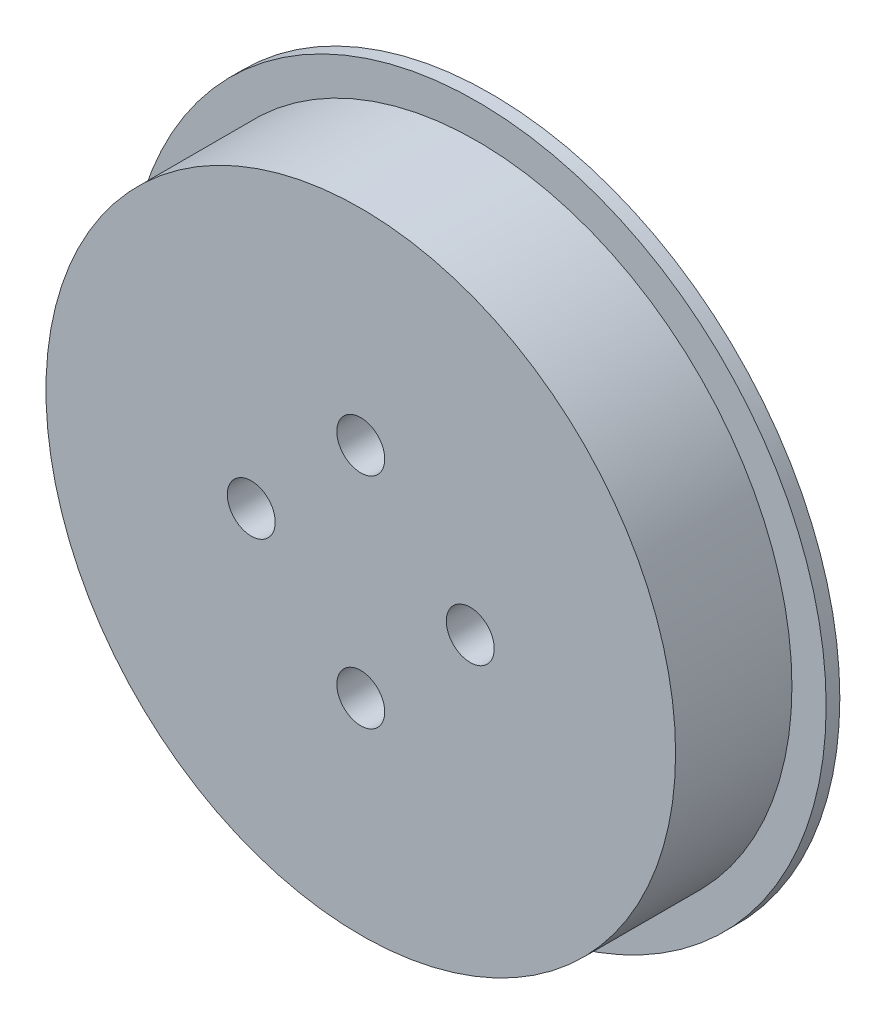
ISO-10303-21;
HEADER;
FILE_DESCRIPTION(('STEP AP214'),'2;1');
FILE_NAME('part.step','',(''),(''),'','','');
FILE_SCHEMA(('AUTOMOTIVE_DESIGN { 1 0 10303 214 1 1 1 1 }'));
ENDSEC;
DATA;
#1=APPLICATION_CONTEXT('core data for automotive mechanical design processes');
#2=APPLICATION_PROTOCOL_DEFINITION('international standard','automotive_design',2000,#1);
#3=PRODUCT_CONTEXT('',#1,'mechanical');
#4=PRODUCT('Part','Part','',(#3));
#5=PRODUCT_RELATED_PRODUCT_CATEGORY('part','',(#4));
#6=PRODUCT_DEFINITION_FORMATION('','',#4);
#7=PRODUCT_DEFINITION_CONTEXT('part definition',#1,'design');
#8=PRODUCT_DEFINITION('design','',#6,#7);
#9=PRODUCT_DEFINITION_SHAPE('','',#8);
#10=(LENGTH_UNIT() NAMED_UNIT(*) SI_UNIT(.MILLI.,.METRE.));
#11=(NAMED_UNIT(*) PLANE_ANGLE_UNIT() SI_UNIT($,.RADIAN.));
#12=(NAMED_UNIT(*) SI_UNIT($,.STERADIAN.) SOLID_ANGLE_UNIT());
#13=UNCERTAINTY_MEASURE_WITH_UNIT(LENGTH_MEASURE(1.E-05),#10,'distance_accuracy_value','');
#14=(GEOMETRIC_REPRESENTATION_CONTEXT(3) GLOBAL_UNCERTAINTY_ASSIGNED_CONTEXT((#13)) GLOBAL_UNIT_ASSIGNED_CONTEXT((#10,
#11,#12)) REPRESENTATION_CONTEXT('',''));
#15=CARTESIAN_POINT('',(0.,0.,0.));
#16=DIRECTION('',(0.,0.,1.));
#17=DIRECTION('',(1.,0.,0.));
#18=AXIS2_PLACEMENT_3D('',#15,#16,#17);
#19=CARTESIAN_POINT('',(0.,-8.,9.5));
#20=DIRECTION('',(0.,0.,-1.));
#21=DIRECTION('',(-1.,0.,0.));
#22=AXIS2_PLACEMENT_3D('',#19,#20,#21);
#23=CYLINDRICAL_SURFACE('',#22,1.75);
#24=CARTESIAN_POINT('',(0.,-8.,5.));
#25=DIRECTION('',(0.,0.,1.));
#26=DIRECTION('',(1.,0.,0.));
#27=AXIS2_PLACEMENT_3D('',#24,#25,#26);
#28=CIRCLE('',#27,1.75);
#29=CARTESIAN_POINT('',(1.74999999999994,-8.,5.));
#30=VERTEX_POINT('',#29);
#31=EDGE_CURVE('E92',#30,#30,#28,.T.);
#32=ORIENTED_EDGE('',*,*,#31,.F.);
#33=EDGE_LOOP('',(#32));
#34=FACE_BOUND('',#33,.T.);
#35=CARTESIAN_POINT('',(0.,-8.,9.5));
#36=DIRECTION('',(0.,0.,1.));
#37=DIRECTION('',(1.,0.,0.));
#38=AXIS2_PLACEMENT_3D('',#35,#36,#37);
#39=CIRCLE('',#38,1.75);
#40=CARTESIAN_POINT('',(1.74999999999994,-8.,9.5));
#41=VERTEX_POINT('',#40);
#42=EDGE_CURVE('E47',#41,#41,#39,.T.);
#43=ORIENTED_EDGE('',*,*,#42,.T.);
#44=EDGE_LOOP('',(#43));
#45=FACE_BOUND('',#44,.T.);
#46=ADVANCED_FACE('F39',(#34,#45),#23,.F.);
#47=CARTESIAN_POINT('',(-8.,0.,9.5));
#48=DIRECTION('',(0.,0.,-1.));
#49=DIRECTION('',(-1.,0.,0.));
#50=AXIS2_PLACEMENT_3D('',#47,#48,#49);
#51=CYLINDRICAL_SURFACE('',#50,1.75);
#52=CARTESIAN_POINT('',(-8.,0.,5.));
#53=DIRECTION('',(0.,0.,1.));
#54=DIRECTION('',(1.,0.,0.));
#55=AXIS2_PLACEMENT_3D('',#52,#53,#54);
#56=CIRCLE('',#55,1.75);
#57=CARTESIAN_POINT('',(-6.25,0.,5.));
#58=VERTEX_POINT('',#57);
#59=EDGE_CURVE('E96',#58,#58,#56,.T.);
#60=ORIENTED_EDGE('',*,*,#59,.F.);
#61=EDGE_LOOP('',(#60));
#62=FACE_BOUND('',#61,.T.);
#63=CARTESIAN_POINT('',(-8.,0.,9.5));
#64=DIRECTION('',(0.,0.,1.));
#65=DIRECTION('',(1.,0.,0.));
#66=AXIS2_PLACEMENT_3D('',#63,#64,#65);
#67=CIRCLE('',#66,1.75);
#68=CARTESIAN_POINT('',(-6.25,0.,9.5));
#69=VERTEX_POINT('',#68);
#70=EDGE_CURVE('E52',#69,#69,#67,.T.);
#71=ORIENTED_EDGE('',*,*,#70,.T.);
#72=EDGE_LOOP('',(#71));
#73=FACE_BOUND('',#72,.T.);
#74=ADVANCED_FACE('F110',(#62,#73),#51,.F.);
#75=CARTESIAN_POINT('',(0.,8.,9.5));
#76=DIRECTION('',(0.,0.,-1.));
#77=DIRECTION('',(-1.,0.,0.));
#78=AXIS2_PLACEMENT_3D('',#75,#76,#77);
#79=CYLINDRICAL_SURFACE('',#78,1.75);
#80=CARTESIAN_POINT('',(0.,8.,5.));
#81=DIRECTION('',(0.,0.,1.));
#82=DIRECTION('',(1.,0.,0.));
#83=AXIS2_PLACEMENT_3D('',#80,#81,#82);
#84=CIRCLE('',#83,1.75);
#85=CARTESIAN_POINT('',(1.75,8.,5.));
#86=VERTEX_POINT('',#85);
#87=EDGE_CURVE('E84',#86,#86,#84,.T.);
#88=ORIENTED_EDGE('',*,*,#87,.F.);
#89=EDGE_LOOP('',(#88));
#90=FACE_BOUND('',#89,.T.);
#91=CARTESIAN_POINT('',(0.,8.,9.5));
#92=DIRECTION('',(0.,0.,1.));
#93=DIRECTION('',(1.,0.,0.));
#94=AXIS2_PLACEMENT_3D('',#91,#92,#93);
#95=CIRCLE('',#94,1.75);
#96=CARTESIAN_POINT('',(1.75,8.,9.5));
#97=VERTEX_POINT('',#96);
#98=EDGE_CURVE('E57',#97,#97,#95,.T.);
#99=ORIENTED_EDGE('',*,*,#98,.T.);
#100=EDGE_LOOP('',(#99));
#101=FACE_BOUND('',#100,.T.);
#102=ADVANCED_FACE('F107',(#90,#101),#79,.F.);
#103=CARTESIAN_POINT('',(0.,0.,9.5));
#104=DIRECTION('',(0.,0.,-1.));
#105=DIRECTION('',(-1.,0.,0.));
#106=AXIS2_PLACEMENT_3D('',#103,#104,#105);
#107=CYLINDRICAL_SURFACE('',#106,23.);
#108=CARTESIAN_POINT('',(0.,0.,1.));
#109=DIRECTION('',(0.,0.,1.));
#110=DIRECTION('',(1.,0.,0.));
#111=AXIS2_PLACEMENT_3D('',#108,#109,#110);
#112=CIRCLE('',#111,23.);
#113=CARTESIAN_POINT('',(23.,0.,1.));
#114=VERTEX_POINT('',#113);
#115=EDGE_CURVE('E72',#114,#114,#112,.T.);
#116=ORIENTED_EDGE('',*,*,#115,.T.);
#117=EDGE_LOOP('',(#116));
#118=FACE_BOUND('',#117,.T.);
#119=CARTESIAN_POINT('',(0.,0.,9.5));
#120=DIRECTION('',(0.,0.,1.));
#121=DIRECTION('',(1.,0.,0.));
#122=AXIS2_PLACEMENT_3D('',#119,#120,#121);
#123=CIRCLE('',#122,23.);
#124=CARTESIAN_POINT('',(23.,0.,9.5));
#125=VERTEX_POINT('',#124);
#126=EDGE_CURVE('E63',#125,#125,#123,.T.);
#127=ORIENTED_EDGE('',*,*,#126,.F.);
#128=EDGE_LOOP('',(#127));
#129=FACE_BOUND('',#128,.T.);
#130=ADVANCED_FACE('F41',(#118,#129),#107,.T.);
#131=CARTESIAN_POINT('',(8.,0.,9.5));
#132=DIRECTION('',(0.,0.,-1.));
#133=DIRECTION('',(-1.,0.,0.));
#134=AXIS2_PLACEMENT_3D('',#131,#132,#133);
#135=CYLINDRICAL_SURFACE('',#134,1.75);
#136=CARTESIAN_POINT('',(8.,0.,5.));
#137=DIRECTION('',(0.,0.,1.));
#138=DIRECTION('',(1.,0.,0.));
#139=AXIS2_PLACEMENT_3D('',#136,#137,#138);
#140=CIRCLE('',#139,1.75);
#141=CARTESIAN_POINT('',(9.75,0.,5.));
#142=VERTEX_POINT('',#141);
#143=EDGE_CURVE('E88',#142,#142,#140,.T.);
#144=ORIENTED_EDGE('',*,*,#143,.F.);
#145=EDGE_LOOP('',(#144));
#146=FACE_BOUND('',#145,.T.);
#147=CARTESIAN_POINT('',(8.,0.,9.5));
#148=DIRECTION('',(0.,0.,1.));
#149=DIRECTION('',(1.,0.,0.));
#150=AXIS2_PLACEMENT_3D('',#147,#148,#149);
#151=CIRCLE('',#150,1.75);
#152=CARTESIAN_POINT('',(9.75,0.,9.5));
#153=VERTEX_POINT('',#152);
#154=EDGE_CURVE('E10',#153,#153,#151,.T.);
#155=ORIENTED_EDGE('',*,*,#154,.T.);
#156=EDGE_LOOP('',(#155));
#157=FACE_BOUND('',#156,.T.);
#158=ADVANCED_FACE('F117',(#146,#157),#135,.F.);
#159=CARTESIAN_POINT('',(0.,0.,9.5));
#160=DIRECTION('',(0.,0.,1.));
#161=DIRECTION('',(1.,0.,0.));
#162=AXIS2_PLACEMENT_3D('',#159,#160,#161);
#163=PLANE('',#162);
#164=ORIENTED_EDGE('',*,*,#126,.T.);
#165=EDGE_LOOP('',(#164));
#166=FACE_BOUND('',#165,.T.);
#167=ORIENTED_EDGE('',*,*,#98,.F.);
#168=EDGE_LOOP('',(#167));
#169=FACE_BOUND('',#168,.T.);
#170=ORIENTED_EDGE('',*,*,#70,.F.);
#171=EDGE_LOOP('',(#170));
#172=FACE_BOUND('',#171,.T.);
#173=ORIENTED_EDGE('',*,*,#42,.F.);
#174=EDGE_LOOP('',(#173));
#175=FACE_BOUND('',#174,.T.);
#176=ORIENTED_EDGE('',*,*,#154,.F.);
#177=EDGE_LOOP('',(#176));
#178=FACE_BOUND('',#177,.T.);
#179=ADVANCED_FACE('F113',(#166,#169,#172,#175,#178),#163,.T.);
#180=CARTESIAN_POINT('',(0.,0.,0.));
#181=DIRECTION('',(0.,0.,1.));
#182=DIRECTION('',(1.,0.,0.));
#183=AXIS2_PLACEMENT_3D('',#180,#181,#182);
#184=PLANE('',#183);
#185=CARTESIAN_POINT('',(0.,0.,0.));
#186=DIRECTION('',(0.,0.,1.));
#187=DIRECTION('',(1.,0.,0.));
#188=AXIS2_PLACEMENT_3D('',#185,#186,#187);
#189=CIRCLE('',#188,12.5);
#190=CARTESIAN_POINT('',(12.5,0.,0.));
#191=VERTEX_POINT('',#190);
#192=EDGE_CURVE('E80',#191,#191,#189,.T.);
#193=ORIENTED_EDGE('',*,*,#192,.T.);
#194=EDGE_LOOP('',(#193));
#195=FACE_BOUND('',#194,.T.);
#196=CARTESIAN_POINT('',(0.,0.,0.));
#197=DIRECTION('',(0.,0.,1.));
#198=DIRECTION('',(1.,0.,0.));
#199=AXIS2_PLACEMENT_3D('',#196,#197,#198);
#200=CIRCLE('',#199,25.5);
#201=CARTESIAN_POINT('',(25.5,0.,0.));
#202=VERTEX_POINT('',#201);
#203=EDGE_CURVE('E68',#202,#202,#200,.T.);
#204=ORIENTED_EDGE('',*,*,#203,.F.);
#205=EDGE_LOOP('',(#204));
#206=FACE_BOUND('',#205,.T.);
#207=ADVANCED_FACE('F116',(#195,#206),#184,.F.);
#208=CARTESIAN_POINT('',(0.,0.,1.));
#209=DIRECTION('',(0.,0.,-1.));
#210=DIRECTION('',(-1.,0.,0.));
#211=AXIS2_PLACEMENT_3D('',#208,#209,#210);
#212=CYLINDRICAL_SURFACE('',#211,25.5);
#213=CARTESIAN_POINT('',(0.,0.,1.));
#214=DIRECTION('',(0.,0.,1.));
#215=DIRECTION('',(1.,0.,0.));
#216=AXIS2_PLACEMENT_3D('',#213,#214,#215);
#217=CIRCLE('',#216,25.5);
#218=CARTESIAN_POINT('',(25.5,0.,1.));
#219=VERTEX_POINT('',#218);
#220=EDGE_CURVE('E67',#219,#219,#217,.T.);
#221=ORIENTED_EDGE('',*,*,#220,.F.);
#222=EDGE_LOOP('',(#221));
#223=FACE_BOUND('',#222,.T.);
#224=ORIENTED_EDGE('',*,*,#203,.T.);
#225=EDGE_LOOP('',(#224));
#226=FACE_BOUND('',#225,.T.);
#227=ADVANCED_FACE('F138',(#223,#226),#212,.T.);
#228=CARTESIAN_POINT('',(0.,0.,1.));
#229=DIRECTION('',(0.,0.,1.));
#230=DIRECTION('',(1.,0.,0.));
#231=AXIS2_PLACEMENT_3D('',#228,#229,#230);
#232=PLANE('',#231);
#233=ORIENTED_EDGE('',*,*,#115,.F.);
#234=EDGE_LOOP('',(#233));
#235=FACE_BOUND('',#234,.T.);
#236=ORIENTED_EDGE('',*,*,#220,.T.);
#237=EDGE_LOOP('',(#236));
#238=FACE_BOUND('',#237,.T.);
#239=ADVANCED_FACE('F143',(#235,#238),#232,.T.);
#240=CARTESIAN_POINT('',(0.,0.,5.));
#241=DIRECTION('',(0.,0.,-1.));
#242=DIRECTION('',(-1.,0.,0.));
#243=AXIS2_PLACEMENT_3D('',#240,#241,#242);
#244=CYLINDRICAL_SURFACE('',#243,12.5);
#245=CARTESIAN_POINT('',(0.,0.,5.));
#246=DIRECTION('',(0.,0.,1.));
#247=DIRECTION('',(1.,0.,0.));
#248=AXIS2_PLACEMENT_3D('',#245,#246,#247);
#249=CIRCLE('',#248,12.5);
#250=CARTESIAN_POINT('',(12.5,0.,5.));
#251=VERTEX_POINT('',#250);
#252=EDGE_CURVE('E73',#251,#251,#249,.T.);
#253=ORIENTED_EDGE('',*,*,#252,.T.);
#254=EDGE_LOOP('',(#253));
#255=FACE_BOUND('',#254,.T.);
#256=ORIENTED_EDGE('',*,*,#192,.F.);
#257=EDGE_LOOP('',(#256));
#258=FACE_BOUND('',#257,.T.);
#259=ADVANCED_FACE('F147',(#255,#258),#244,.F.);
#260=CARTESIAN_POINT('',(0.,0.,5.));
#261=DIRECTION('',(0.,0.,1.));
#262=DIRECTION('',(1.,0.,0.));
#263=AXIS2_PLACEMENT_3D('',#260,#261,#262);
#264=PLANE('',#263);
#265=ORIENTED_EDGE('',*,*,#87,.T.);
#266=EDGE_LOOP('',(#265));
#267=FACE_BOUND('',#266,.T.);
#268=ORIENTED_EDGE('',*,*,#59,.T.);
#269=EDGE_LOOP('',(#268));
#270=FACE_BOUND('',#269,.T.);
#271=ORIENTED_EDGE('',*,*,#31,.T.);
#272=EDGE_LOOP('',(#271));
#273=FACE_BOUND('',#272,.T.);
#274=ORIENTED_EDGE('',*,*,#143,.T.);
#275=EDGE_LOOP('',(#274));
#276=FACE_BOUND('',#275,.T.);
#277=ORIENTED_EDGE('',*,*,#252,.F.);
#278=EDGE_LOOP('',(#277));
#279=FACE_BOUND('',#278,.T.);
#280=ADVANCED_FACE('F104',(#267,#270,#273,#276,#279),#264,.F.);
#281=CLOSED_SHELL('',(#46,#74,#102,#130,#158,#179,#207,#227,#239,#259,#280));
#282=MANIFOLD_SOLID_BREP('B2',#281);
#283=ADVANCED_BREP_SHAPE_REPRESENTATION('',(#18,#282),#14);
#284=SHAPE_DEFINITION_REPRESENTATION(#9,#283);
ENDSEC;
END-ISO-10303-21;
